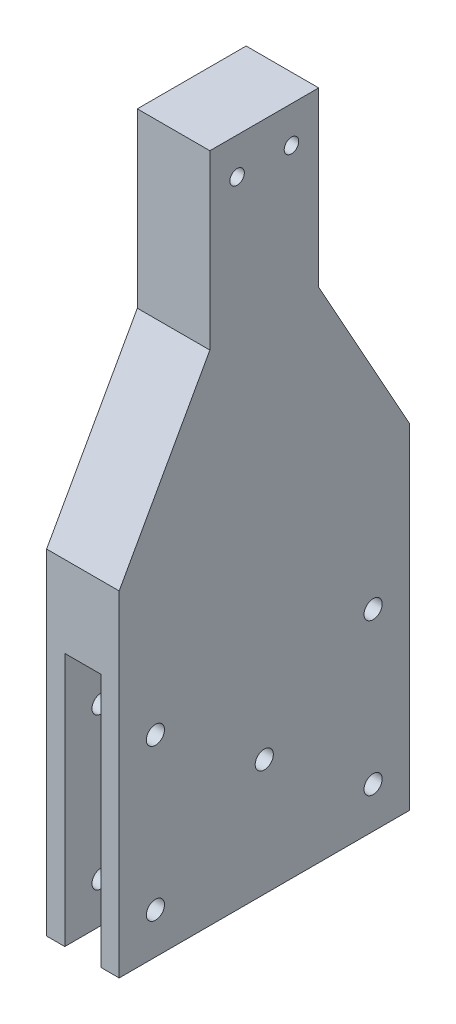
ISO-10303-21;
HEADER;
FILE_DESCRIPTION(('STEP AP214'),'2;1');
FILE_NAME('part.step','',(''),(''),'','','');
FILE_SCHEMA(('AUTOMOTIVE_DESIGN { 1 0 10303 214 1 1 1 1 }'));
ENDSEC;
DATA;
#1=APPLICATION_CONTEXT('core data for automotive mechanical design processes');
#2=APPLICATION_PROTOCOL_DEFINITION('international standard','automotive_design',2000,#1);
#3=PRODUCT_CONTEXT('',#1,'mechanical');
#4=PRODUCT('Part','Part','',(#3));
#5=PRODUCT_RELATED_PRODUCT_CATEGORY('part','',(#4));
#6=PRODUCT_DEFINITION_FORMATION('','',#4);
#7=PRODUCT_DEFINITION_CONTEXT('part definition',#1,'design');
#8=PRODUCT_DEFINITION('design','',#6,#7);
#9=PRODUCT_DEFINITION_SHAPE('','',#8);
#10=(LENGTH_UNIT() NAMED_UNIT(*) SI_UNIT(.MILLI.,.METRE.));
#11=(NAMED_UNIT(*) PLANE_ANGLE_UNIT() SI_UNIT($,.RADIAN.));
#12=(NAMED_UNIT(*) SI_UNIT($,.STERADIAN.) SOLID_ANGLE_UNIT());
#13=UNCERTAINTY_MEASURE_WITH_UNIT(LENGTH_MEASURE(1.E-05),#10,'distance_accuracy_value','');
#14=(GEOMETRIC_REPRESENTATION_CONTEXT(3) GLOBAL_UNCERTAINTY_ASSIGNED_CONTEXT((#13)) GLOBAL_UNIT_ASSIGNED_CONTEXT((#10,
#11,#12)) REPRESENTATION_CONTEXT('',''));
#15=CARTESIAN_POINT('',(0.,0.,0.));
#16=DIRECTION('',(0.,0.,1.));
#17=DIRECTION('',(1.,0.,0.));
#18=AXIS2_PLACEMENT_3D('',#15,#16,#17);
#19=CARTESIAN_POINT('',(0.,0.,80.));
#20=DIRECTION('',(1.,0.,0.));
#21=DIRECTION('',(0.,0.,-1.));
#22=AXIS2_PLACEMENT_3D('',#19,#20,#21);
#23=PLANE('',#22);
#24=CARTESIAN_POINT('',(0.,175.,32.5));
#25=DIRECTION('',(1.,0.,0.));
#26=DIRECTION('',(0.,0.,-1.));
#27=AXIS2_PLACEMENT_3D('',#24,#25,#26);
#28=CIRCLE('',#27,2.);
#29=CARTESIAN_POINT('',(0.,175.,30.5));
#30=VERTEX_POINT('',#29);
#31=EDGE_CURVE('E298',#30,#30,#28,.F.);
#32=ORIENTED_EDGE('',*,*,#31,.F.);
#33=EDGE_LOOP('',(#32));
#34=FACE_BOUND('',#33,.T.);
#35=CARTESIAN_POINT('',(0.,175.,47.5));
#36=DIRECTION('',(1.,0.,0.));
#37=DIRECTION('',(0.,0.,-1.));
#38=AXIS2_PLACEMENT_3D('',#35,#36,#37);
#39=CIRCLE('',#38,2.);
#40=CARTESIAN_POINT('',(0.,175.,45.5));
#41=VERTEX_POINT('',#40);
#42=EDGE_CURVE('E302',#41,#41,#39,.F.);
#43=ORIENTED_EDGE('',*,*,#42,.F.);
#44=EDGE_LOOP('',(#43));
#45=FACE_BOUND('',#44,.T.);
#46=CARTESIAN_POINT('',(0.,53.0571843789609,70.));
#47=DIRECTION('',(1.,0.,0.));
#48=DIRECTION('',(0.,0.,-1.));
#49=AXIS2_PLACEMENT_3D('',#46,#47,#48);
#50=CIRCLE('',#49,2.5);
#51=CARTESIAN_POINT('',(0.,53.0571843789609,67.5));
#52=VERTEX_POINT('',#51);
#53=EDGE_CURVE('E157',#52,#52,#50,.F.);
#54=ORIENTED_EDGE('',*,*,#53,.F.);
#55=EDGE_LOOP('',(#54));
#56=FACE_BOUND('',#55,.T.);
#57=CARTESIAN_POINT('',(0.,53.0571843789609,10.));
#58=DIRECTION('',(1.,0.,0.));
#59=DIRECTION('',(0.,0.,-1.));
#60=AXIS2_PLACEMENT_3D('',#57,#58,#59);
#61=CIRCLE('',#60,2.5);
#62=CARTESIAN_POINT('',(0.,53.0571843789609,7.5));
#63=VERTEX_POINT('',#62);
#64=EDGE_CURVE('E158',#63,#63,#61,.F.);
#65=ORIENTED_EDGE('',*,*,#64,.F.);
#66=EDGE_LOOP('',(#65));
#67=FACE_BOUND('',#66,.T.);
#68=CARTESIAN_POINT('',(0.,11.2845520257299,10.));
#69=DIRECTION('',(1.,0.,0.));
#70=DIRECTION('',(0.,0.,-1.));
#71=AXIS2_PLACEMENT_3D('',#68,#69,#70);
#72=CIRCLE('',#71,2.5);
#73=CARTESIAN_POINT('',(0.,11.2845520257299,7.5));
#74=VERTEX_POINT('',#73);
#75=EDGE_CURVE('E165',#74,#74,#72,.F.);
#76=ORIENTED_EDGE('',*,*,#75,.F.);
#77=EDGE_LOOP('',(#76));
#78=FACE_BOUND('',#77,.T.);
#79=CARTESIAN_POINT('',(0.,32.1708682023454,40.));
#80=DIRECTION('',(1.,0.,0.));
#81=DIRECTION('',(0.,0.,-1.));
#82=AXIS2_PLACEMENT_3D('',#79,#80,#81);
#83=CIRCLE('',#82,2.5);
#84=CARTESIAN_POINT('',(0.,32.1708682023454,37.5));
#85=VERTEX_POINT('',#84);
#86=EDGE_CURVE('E171',#85,#85,#83,.F.);
#87=ORIENTED_EDGE('',*,*,#86,.F.);
#88=EDGE_LOOP('',(#87));
#89=FACE_BOUND('',#88,.T.);
#90=CARTESIAN_POINT('',(0.,11.2845520257299,70.));
#91=DIRECTION('',(1.,0.,0.));
#92=DIRECTION('',(0.,0.,-1.));
#93=AXIS2_PLACEMENT_3D('',#90,#91,#92);
#94=CIRCLE('',#93,2.5);
#95=CARTESIAN_POINT('',(0.,11.2845520257299,67.5));
#96=VERTEX_POINT('',#95);
#97=EDGE_CURVE('E197',#96,#96,#94,.F.);
#98=ORIENTED_EDGE('',*,*,#97,.F.);
#99=EDGE_LOOP('',(#98));
#100=FACE_BOUND('',#99,.T.);
#101=DIRECTION('',(0.,1.,0.));
#102=VECTOR('',#101,1.);
#103=CARTESIAN_POINT('',(0.,0.,55.));
#104=LINE('',#103,#102);
#105=CARTESIAN_POINT('',(0.,137.406088826711,55.));
#106=VERTEX_POINT('',#105);
#107=CARTESIAN_POINT('',(0.,185.,55.));
#108=VERTEX_POINT('',#107);
#109=EDGE_CURVE('E148',#106,#108,#104,.T.);
#110=ORIENTED_EDGE('',*,*,#109,.T.);
#111=DIRECTION('',(0.,0.,-1.));
#112=VECTOR('',#111,1.);
#113=CARTESIAN_POINT('',(0.,185.,80.));
#114=LINE('',#113,#112);
#115=CARTESIAN_POINT('',(0.,185.,25.));
#116=VERTEX_POINT('',#115);
#117=EDGE_CURVE('E120',#108,#116,#114,.T.);
#118=ORIENTED_EDGE('',*,*,#117,.T.);
#119=DIRECTION('',(0.,1.,0.));
#120=VECTOR('',#119,1.);
#121=CARTESIAN_POINT('',(0.,0.,25.));
#122=LINE('',#121,#120);
#123=CARTESIAN_POINT('',(0.,137.406088826711,25.));
#124=VERTEX_POINT('',#123);
#125=EDGE_CURVE('E145',#124,#116,#122,.T.);
#126=ORIENTED_EDGE('',*,*,#125,.F.);
#127=DIRECTION('',(0.,-0.874157276121537,-0.485642931178633));
#128=VECTOR('',#127,1.);
#129=CARTESIAN_POINT('',(0.,21.7938888742245,-39.2289999736039));
#130=LINE('',#129,#128);
#131=CARTESIAN_POINT('',(0.,92.4060888267112,0.));
#132=VERTEX_POINT('',#131);
#133=EDGE_CURVE('E140',#124,#132,#130,.T.);
#134=ORIENTED_EDGE('',*,*,#133,.T.);
#135=DIRECTION('',(0.,-1.,0.));
#136=VECTOR('',#135,1.);
#137=CARTESIAN_POINT('',(0.,0.,0.));
#138=LINE('',#137,#136);
#139=CARTESIAN_POINT('',(0.,0.,0.));
#140=VERTEX_POINT('',#139);
#141=EDGE_CURVE('E227',#132,#140,#138,.T.);
#142=ORIENTED_EDGE('',*,*,#141,.T.);
#143=DIRECTION('',(0.,0.,-1.));
#144=VECTOR('',#143,1.);
#145=CARTESIAN_POINT('',(0.,0.,80.));
#146=LINE('',#145,#144);
#147=CARTESIAN_POINT('',(0.,0.,80.));
#148=VERTEX_POINT('',#147);
#149=EDGE_CURVE('E39',#148,#140,#146,.T.);
#150=ORIENTED_EDGE('',*,*,#149,.F.);
#151=DIRECTION('',(0.,-1.,0.));
#152=VECTOR('',#151,1.);
#153=CARTESIAN_POINT('',(0.,0.,80.));
#154=LINE('',#153,#152);
#155=CARTESIAN_POINT('',(0.,92.4060888267109,80.));
#156=VERTEX_POINT('',#155);
#157=EDGE_CURVE('E228',#156,#148,#154,.T.);
#158=ORIENTED_EDGE('',*,*,#157,.F.);
#159=DIRECTION('',(0.,-0.874157276121537,0.485642931178633));
#160=VECTOR('',#159,1.);
#161=CARTESIAN_POINT('',(0.,55.7561530251678,100.361075445302));
#162=LINE('',#161,#160);
#163=EDGE_CURVE('E152',#106,#156,#162,.T.);
#164=ORIENTED_EDGE('',*,*,#163,.F.);
#165=EDGE_LOOP('',(#110,#118,#126,#134,#142,#150,#158,#164));
#166=FACE_BOUND('',#165,.T.);
#167=ADVANCED_FACE('F32',(#34,#45,#56,#67,#78,#89,#100,#166),#23,.F.);
#168=CARTESIAN_POINT('',(20.,0.,80.));
#169=DIRECTION('',(-1.,0.,0.));
#170=DIRECTION('',(0.,0.,1.));
#171=AXIS2_PLACEMENT_3D('',#168,#169,#170);
#172=PLANE('',#171);
#173=CARTESIAN_POINT('',(20.,175.,32.5));
#174=DIRECTION('',(1.,0.,0.));
#175=DIRECTION('',(0.,0.,-1.));
#176=AXIS2_PLACEMENT_3D('',#173,#174,#175);
#177=CIRCLE('',#176,2.);
#178=CARTESIAN_POINT('',(20.,175.,30.5));
#179=VERTEX_POINT('',#178);
#180=EDGE_CURVE('E331',#179,#179,#177,.T.);
#181=ORIENTED_EDGE('',*,*,#180,.F.);
#182=EDGE_LOOP('',(#181));
#183=FACE_BOUND('',#182,.T.);
#184=CARTESIAN_POINT('',(20.,175.,47.5));
#185=DIRECTION('',(1.,0.,0.));
#186=DIRECTION('',(0.,0.,1.));
#187=AXIS2_PLACEMENT_3D('',#184,#185,#186);
#188=CIRCLE('',#187,2.);
#189=CARTESIAN_POINT('',(20.,175.,49.5));
#190=VERTEX_POINT('',#189);
#191=EDGE_CURVE('E124',#190,#190,#188,.T.);
#192=ORIENTED_EDGE('',*,*,#191,.F.);
#193=EDGE_LOOP('',(#192));
#194=FACE_BOUND('',#193,.T.);
#195=CARTESIAN_POINT('',(20.0000000000001,53.0571843789609,70.));
#196=DIRECTION('',(1.,0.,0.));
#197=DIRECTION('',(0.,1.,0.));
#198=AXIS2_PLACEMENT_3D('',#195,#196,#197);
#199=CIRCLE('',#198,2.5);
#200=CARTESIAN_POINT('',(20.0000000000001,55.5571843789609,70.));
#201=VERTEX_POINT('',#200);
#202=EDGE_CURVE('E154',#201,#201,#199,.T.);
#203=ORIENTED_EDGE('',*,*,#202,.F.);
#204=EDGE_LOOP('',(#203));
#205=FACE_BOUND('',#204,.T.);
#206=CARTESIAN_POINT('',(20.0000000000001,53.0571843789609,10.));
#207=DIRECTION('',(1.,0.,0.));
#208=DIRECTION('',(0.,1.,0.));
#209=AXIS2_PLACEMENT_3D('',#206,#207,#208);
#210=CIRCLE('',#209,2.5);
#211=CARTESIAN_POINT('',(20.0000000000001,55.5571843789609,10.));
#212=VERTEX_POINT('',#211);
#213=EDGE_CURVE('E162',#212,#212,#210,.T.);
#214=ORIENTED_EDGE('',*,*,#213,.F.);
#215=EDGE_LOOP('',(#214));
#216=FACE_BOUND('',#215,.T.);
#217=CARTESIAN_POINT('',(20.0000000000001,11.2845520257299,10.));
#218=DIRECTION('',(1.,0.,0.));
#219=DIRECTION('',(0.,1.,0.));
#220=AXIS2_PLACEMENT_3D('',#217,#218,#219);
#221=CIRCLE('',#220,2.5);
#222=CARTESIAN_POINT('',(20.0000000000001,13.7845520257299,10.));
#223=VERTEX_POINT('',#222);
#224=EDGE_CURVE('E168',#223,#223,#221,.T.);
#225=ORIENTED_EDGE('',*,*,#224,.F.);
#226=EDGE_LOOP('',(#225));
#227=FACE_BOUND('',#226,.T.);
#228=CARTESIAN_POINT('',(20.0000000000001,32.1708682023454,40.));
#229=DIRECTION('',(1.,0.,0.));
#230=DIRECTION('',(0.,1.,0.));
#231=AXIS2_PLACEMENT_3D('',#228,#229,#230);
#232=CIRCLE('',#231,2.5);
#233=CARTESIAN_POINT('',(20.0000000000001,34.6708682023454,40.));
#234=VERTEX_POINT('',#233);
#235=EDGE_CURVE('E174',#234,#234,#232,.T.);
#236=ORIENTED_EDGE('',*,*,#235,.F.);
#237=EDGE_LOOP('',(#236));
#238=FACE_BOUND('',#237,.T.);
#239=CARTESIAN_POINT('',(20.0000000000001,11.2845520257299,70.));
#240=DIRECTION('',(1.,0.,0.));
#241=DIRECTION('',(0.,1.,0.));
#242=AXIS2_PLACEMENT_3D('',#239,#240,#241);
#243=CIRCLE('',#242,2.5);
#244=CARTESIAN_POINT('',(20.0000000000001,13.7845520257299,70.));
#245=VERTEX_POINT('',#244);
#246=EDGE_CURVE('E194',#245,#245,#243,.T.);
#247=ORIENTED_EDGE('',*,*,#246,.F.);
#248=EDGE_LOOP('',(#247));
#249=FACE_BOUND('',#248,.T.);
#250=DIRECTION('',(0.,-1.,0.));
#251=VECTOR('',#250,1.);
#252=CARTESIAN_POINT('',(20.,0.,25.));
#253=LINE('',#252,#251);
#254=CARTESIAN_POINT('',(20.,185.,25.));
#255=VERTEX_POINT('',#254);
#256=CARTESIAN_POINT('',(20.,137.406088826711,25.));
#257=VERTEX_POINT('',#256);
#258=EDGE_CURVE('E133',#255,#257,#253,.T.);
#259=ORIENTED_EDGE('',*,*,#258,.F.);
#260=DIRECTION('',(0.,0.,-1.));
#261=VECTOR('',#260,1.);
#262=CARTESIAN_POINT('',(20.,185.,0.));
#263=LINE('',#262,#261);
#264=CARTESIAN_POINT('',(20.,185.,55.));
#265=VERTEX_POINT('',#264);
#266=EDGE_CURVE('E46',#265,#255,#263,.T.);
#267=ORIENTED_EDGE('',*,*,#266,.F.);
#268=DIRECTION('',(0.,-1.,0.));
#269=VECTOR('',#268,1.);
#270=CARTESIAN_POINT('',(20.,0.,55.));
#271=LINE('',#270,#269);
#272=CARTESIAN_POINT('',(20.,137.406088826711,55.));
#273=VERTEX_POINT('',#272);
#274=EDGE_CURVE('E130',#265,#273,#271,.T.);
#275=ORIENTED_EDGE('',*,*,#274,.T.);
#276=DIRECTION('',(0.,0.874157276121538,-0.485642931178633));
#277=VECTOR('',#276,1.);
#278=CARTESIAN_POINT('',(20.,55.7561530251678,100.361075445302));
#279=LINE('',#278,#277);
#280=CARTESIAN_POINT('',(20.,92.4060888267109,80.));
#281=VERTEX_POINT('',#280);
#282=EDGE_CURVE('E139',#281,#273,#279,.T.);
#283=ORIENTED_EDGE('',*,*,#282,.F.);
#284=DIRECTION('',(0.,1.,0.));
#285=VECTOR('',#284,1.);
#286=CARTESIAN_POINT('',(20.,0.,80.));
#287=LINE('',#286,#285);
#288=CARTESIAN_POINT('',(20.,0.,80.));
#289=VERTEX_POINT('',#288);
#290=EDGE_CURVE('E235',#289,#281,#287,.T.);
#291=ORIENTED_EDGE('',*,*,#290,.F.);
#292=DIRECTION('',(0.,0.,-1.));
#293=VECTOR('',#292,1.);
#294=CARTESIAN_POINT('',(20.,0.,80.));
#295=LINE('',#294,#293);
#296=CARTESIAN_POINT('',(20.,0.,0.));
#297=VERTEX_POINT('',#296);
#298=EDGE_CURVE('E238',#289,#297,#295,.T.);
#299=ORIENTED_EDGE('',*,*,#298,.T.);
#300=DIRECTION('',(0.,1.,0.));
#301=VECTOR('',#300,1.);
#302=CARTESIAN_POINT('',(20.,0.,0.));
#303=LINE('',#302,#301);
#304=CARTESIAN_POINT('',(20.,92.4060888267112,0.));
#305=VERTEX_POINT('',#304);
#306=EDGE_CURVE('E231',#297,#305,#303,.T.);
#307=ORIENTED_EDGE('',*,*,#306,.T.);
#308=DIRECTION('',(0.,0.874157276121537,0.485642931178634));
#309=VECTOR('',#308,1.);
#310=CARTESIAN_POINT('',(20.,21.7938888742245,-39.2289999736039));
#311=LINE('',#310,#309);
#312=EDGE_CURVE('E327',#305,#257,#311,.T.);
#313=ORIENTED_EDGE('',*,*,#312,.T.);
#314=EDGE_LOOP('',(#259,#267,#275,#283,#291,#299,#307,#313));
#315=FACE_BOUND('',#314,.T.);
#316=ADVANCED_FACE('F128',(#183,#194,#205,#216,#227,#238,#249,#315),#172,.F.);
#317=CARTESIAN_POINT('',(0.,0.,0.));
#318=DIRECTION('',(0.,0.,-1.));
#319=DIRECTION('',(-1.,0.,0.));
#320=AXIS2_PLACEMENT_3D('',#317,#318,#319);
#321=PLANE('',#320);
#322=ORIENTED_EDGE('',*,*,#141,.F.);
#323=DIRECTION('',(1.,0.,0.));
#324=VECTOR('',#323,1.);
#325=CARTESIAN_POINT('',(-268.759188302499,92.4060888267112,0.));
#326=LINE('',#325,#324);
#327=EDGE_CURVE('E320',#132,#305,#326,.T.);
#328=ORIENTED_EDGE('',*,*,#327,.T.);
#329=ORIENTED_EDGE('',*,*,#306,.F.);
#330=DIRECTION('',(1.,0.,0.));
#331=VECTOR('',#330,1.);
#332=CARTESIAN_POINT('',(0.,0.,0.));
#333=LINE('',#332,#331);
#334=CARTESIAN_POINT('',(15.,0.,0.));
#335=VERTEX_POINT('',#334);
#336=EDGE_CURVE('E240',#335,#297,#333,.T.);
#337=ORIENTED_EDGE('',*,*,#336,.F.);
#338=DIRECTION('',(0.,1.,0.));
#339=VECTOR('',#338,1.);
#340=CARTESIAN_POINT('',(15.,70.,0.));
#341=LINE('',#340,#339);
#342=CARTESIAN_POINT('',(15.,70.,0.));
#343=VERTEX_POINT('',#342);
#344=EDGE_CURVE('E220',#335,#343,#341,.T.);
#345=ORIENTED_EDGE('',*,*,#344,.T.);
#346=DIRECTION('',(-1.,0.,0.));
#347=VECTOR('',#346,1.);
#348=CARTESIAN_POINT('',(4.99999999999998,70.,0.));
#349=LINE('',#348,#347);
#350=CARTESIAN_POINT('',(4.99999999999998,70.,0.));
#351=VERTEX_POINT('',#350);
#352=EDGE_CURVE('E216',#343,#351,#349,.T.);
#353=ORIENTED_EDGE('',*,*,#352,.T.);
#354=DIRECTION('',(0.,-1.,0.));
#355=VECTOR('',#354,1.);
#356=CARTESIAN_POINT('',(4.99999999999998,70.,0.));
#357=LINE('',#356,#355);
#358=CARTESIAN_POINT('',(5.,0.,0.));
#359=VERTEX_POINT('',#358);
#360=EDGE_CURVE('E213',#351,#359,#357,.T.);
#361=ORIENTED_EDGE('',*,*,#360,.T.);
#362=EDGE_CURVE('E241',#140,#359,#333,.T.);
#363=ORIENTED_EDGE('',*,*,#362,.F.);
#364=EDGE_LOOP('',(#322,#328,#329,#337,#345,#353,#361,#363));
#365=FACE_BOUND('',#364,.T.);
#366=ADVANCED_FACE('F292',(#365),#321,.T.);
#367=CARTESIAN_POINT('',(0.,0.,80.));
#368=DIRECTION('',(0.,1.,0.));
#369=DIRECTION('',(0.,0.,1.));
#370=AXIS2_PLACEMENT_3D('',#367,#368,#369);
#371=PLANE('',#370);
#372=DIRECTION('',(1.,0.,0.));
#373=VECTOR('',#372,1.);
#374=CARTESIAN_POINT('',(0.,0.,80.));
#375=LINE('',#374,#373);
#376=CARTESIAN_POINT('',(15.,0.,80.));
#377=VERTEX_POINT('',#376);
#378=EDGE_CURVE('E230',#377,#289,#375,.T.);
#379=ORIENTED_EDGE('',*,*,#378,.F.);
#380=DIRECTION('',(0.,0.,1.));
#381=VECTOR('',#380,1.);
#382=CARTESIAN_POINT('',(15.,0.,-70.7106781186548));
#383=LINE('',#382,#381);
#384=EDGE_CURVE('E208',#335,#377,#383,.T.);
#385=ORIENTED_EDGE('',*,*,#384,.F.);
#386=ORIENTED_EDGE('',*,*,#336,.T.);
#387=ORIENTED_EDGE('',*,*,#298,.F.);
#388=EDGE_LOOP('',(#379,#385,#386,#387));
#389=FACE_BOUND('',#388,.T.);
#390=ADVANCED_FACE('F377',(#389),#371,.F.);
#391=ORIENTED_EDGE('',*,*,#362,.T.);
#392=DIRECTION('',(0.,0.,1.));
#393=VECTOR('',#392,1.);
#394=CARTESIAN_POINT('',(5.00000000000001,0.,-70.7106781186548));
#395=LINE('',#394,#393);
#396=CARTESIAN_POINT('',(5.00000000000001,0.,80.));
#397=VERTEX_POINT('',#396);
#398=EDGE_CURVE('E53',#359,#397,#395,.T.);
#399=ORIENTED_EDGE('',*,*,#398,.T.);
#400=EDGE_CURVE('E232',#148,#397,#375,.T.);
#401=ORIENTED_EDGE('',*,*,#400,.F.);
#402=ORIENTED_EDGE('',*,*,#149,.T.);
#403=EDGE_LOOP('',(#391,#399,#401,#402));
#404=FACE_BOUND('',#403,.T.);
#405=ADVANCED_FACE('F385',(#404),#371,.F.);
#406=CARTESIAN_POINT('',(0.,0.,80.));
#407=DIRECTION('',(0.,0.,-1.));
#408=DIRECTION('',(-1.,0.,0.));
#409=AXIS2_PLACEMENT_3D('',#406,#407,#408);
#410=PLANE('',#409);
#411=ORIENTED_EDGE('',*,*,#290,.T.);
#412=DIRECTION('',(1.,0.,0.));
#413=VECTOR('',#412,1.);
#414=CARTESIAN_POINT('',(-268.759188302499,92.4060888267109,80.));
#415=LINE('',#414,#413);
#416=EDGE_CURVE('E142',#156,#281,#415,.T.);
#417=ORIENTED_EDGE('',*,*,#416,.F.);
#418=ORIENTED_EDGE('',*,*,#157,.T.);
#419=ORIENTED_EDGE('',*,*,#400,.T.);
#420=DIRECTION('',(0.,-1.,0.));
#421=VECTOR('',#420,1.);
#422=CARTESIAN_POINT('',(4.99999999999998,70.,80.));
#423=LINE('',#422,#421);
#424=CARTESIAN_POINT('',(4.99999999999998,70.,80.));
#425=VERTEX_POINT('',#424);
#426=EDGE_CURVE('E204',#425,#397,#423,.T.);
#427=ORIENTED_EDGE('',*,*,#426,.F.);
#428=DIRECTION('',(-1.,0.,0.));
#429=VECTOR('',#428,1.);
#430=CARTESIAN_POINT('',(4.99999999999998,70.,80.));
#431=LINE('',#430,#429);
#432=CARTESIAN_POINT('',(15.,70.,80.));
#433=VERTEX_POINT('',#432);
#434=EDGE_CURVE('E205',#433,#425,#431,.T.);
#435=ORIENTED_EDGE('',*,*,#434,.F.);
#436=DIRECTION('',(0.,1.,0.));
#437=VECTOR('',#436,1.);
#438=CARTESIAN_POINT('',(15.,70.,80.));
#439=LINE('',#438,#437);
#440=EDGE_CURVE('E209',#377,#433,#439,.T.);
#441=ORIENTED_EDGE('',*,*,#440,.F.);
#442=ORIENTED_EDGE('',*,*,#378,.T.);
#443=EDGE_LOOP('',(#411,#417,#418,#419,#427,#435,#441,#442));
#444=FACE_BOUND('',#443,.T.);
#445=ADVANCED_FACE('F364',(#444),#410,.F.);
#446=CARTESIAN_POINT('',(15.,70.,-70.7106781186548));
#447=DIRECTION('',(1.,0.,0.));
#448=DIRECTION('',(0.,1.,0.));
#449=AXIS2_PLACEMENT_3D('',#446,#447,#448);
#450=PLANE('',#449);
#451=CARTESIAN_POINT('',(15.,53.0571843789609,70.));
#452=DIRECTION('',(1.,0.,0.));
#453=DIRECTION('',(0.,1.,0.));
#454=AXIS2_PLACEMENT_3D('',#451,#452,#453);
#455=CIRCLE('',#454,2.5);
#456=CARTESIAN_POINT('',(15.,55.5571843789609,70.));
#457=VERTEX_POINT('',#456);
#458=EDGE_CURVE('E191',#457,#457,#455,.T.);
#459=ORIENTED_EDGE('',*,*,#458,.T.);
#460=EDGE_LOOP('',(#459));
#461=FACE_BOUND('',#460,.T.);
#462=CARTESIAN_POINT('',(15.,53.0571843789609,10.));
#463=DIRECTION('',(1.,0.,0.));
#464=DIRECTION('',(0.,1.,0.));
#465=AXIS2_PLACEMENT_3D('',#462,#463,#464);
#466=CIRCLE('',#465,2.5);
#467=CARTESIAN_POINT('',(15.,55.5571843789609,10.));
#468=VERTEX_POINT('',#467);
#469=EDGE_CURVE('E187',#468,#468,#466,.T.);
#470=ORIENTED_EDGE('',*,*,#469,.T.);
#471=EDGE_LOOP('',(#470));
#472=FACE_BOUND('',#471,.T.);
#473=CARTESIAN_POINT('',(15.,11.2845520257299,10.));
#474=DIRECTION('',(1.,0.,0.));
#475=DIRECTION('',(0.,1.,0.));
#476=AXIS2_PLACEMENT_3D('',#473,#474,#475);
#477=CIRCLE('',#476,2.5);
#478=CARTESIAN_POINT('',(15.,13.7845520257299,10.));
#479=VERTEX_POINT('',#478);
#480=EDGE_CURVE('E183',#479,#479,#477,.T.);
#481=ORIENTED_EDGE('',*,*,#480,.T.);
#482=EDGE_LOOP('',(#481));
#483=FACE_BOUND('',#482,.T.);
#484=CARTESIAN_POINT('',(15.,32.1708682023454,40.));
#485=DIRECTION('',(1.,0.,0.));
#486=DIRECTION('',(0.,1.,0.));
#487=AXIS2_PLACEMENT_3D('',#484,#485,#486);
#488=CIRCLE('',#487,2.5);
#489=CARTESIAN_POINT('',(15.,34.6708682023454,40.));
#490=VERTEX_POINT('',#489);
#491=EDGE_CURVE('E179',#490,#490,#488,.T.);
#492=ORIENTED_EDGE('',*,*,#491,.T.);
#493=EDGE_LOOP('',(#492));
#494=FACE_BOUND('',#493,.T.);
#495=CARTESIAN_POINT('',(15.,11.2845520257299,70.));
#496=DIRECTION('',(1.,0.,0.));
#497=DIRECTION('',(0.,1.,0.));
#498=AXIS2_PLACEMENT_3D('',#495,#496,#497);
#499=CIRCLE('',#498,2.5);
#500=CARTESIAN_POINT('',(15.,13.7845520257299,70.));
#501=VERTEX_POINT('',#500);
#502=EDGE_CURVE('E201',#501,#501,#499,.T.);
#503=ORIENTED_EDGE('',*,*,#502,.T.);
#504=EDGE_LOOP('',(#503));
#505=FACE_BOUND('',#504,.T.);
#506=ORIENTED_EDGE('',*,*,#384,.T.);
#507=ORIENTED_EDGE('',*,*,#440,.T.);
#508=DIRECTION('',(0.,0.,1.));
#509=VECTOR('',#508,1.);
#510=CARTESIAN_POINT('',(15.,70.,-70.7106781186548));
#511=LINE('',#510,#509);
#512=EDGE_CURVE('E219',#343,#433,#511,.T.);
#513=ORIENTED_EDGE('',*,*,#512,.F.);
#514=ORIENTED_EDGE('',*,*,#344,.F.);
#515=EDGE_LOOP('',(#506,#507,#513,#514));
#516=FACE_BOUND('',#515,.T.);
#517=ADVANCED_FACE('F360',(#461,#472,#483,#494,#505,#516),#450,.F.);
#518=CARTESIAN_POINT('',(4.99999999999998,70.,-70.7106781186548));
#519=DIRECTION('',(0.,1.,0.));
#520=DIRECTION('',(-1.,0.,0.));
#521=AXIS2_PLACEMENT_3D('',#518,#519,#520);
#522=PLANE('',#521);
#523=ORIENTED_EDGE('',*,*,#512,.T.);
#524=ORIENTED_EDGE('',*,*,#434,.T.);
#525=DIRECTION('',(0.,0.,1.));
#526=VECTOR('',#525,1.);
#527=CARTESIAN_POINT('',(4.99999999999998,70.,-70.7106781186548));
#528=LINE('',#527,#526);
#529=EDGE_CURVE('E215',#351,#425,#528,.T.);
#530=ORIENTED_EDGE('',*,*,#529,.F.);
#531=ORIENTED_EDGE('',*,*,#352,.F.);
#532=EDGE_LOOP('',(#523,#524,#530,#531));
#533=FACE_BOUND('',#532,.T.);
#534=ADVANCED_FACE('F363',(#533),#522,.F.);
#535=CARTESIAN_POINT('',(4.99999999999998,70.,-70.7106781186548));
#536=DIRECTION('',(-1.,0.,0.));
#537=DIRECTION('',(0.,-1.,0.));
#538=AXIS2_PLACEMENT_3D('',#535,#536,#537);
#539=PLANE('',#538);
#540=CARTESIAN_POINT('',(4.99999999999999,53.0571843789609,70.));
#541=DIRECTION('',(-1.,0.,0.));
#542=DIRECTION('',(0.,-1.,0.));
#543=AXIS2_PLACEMENT_3D('',#540,#541,#542);
#544=CIRCLE('',#543,2.5);
#545=CARTESIAN_POINT('',(4.99999999999999,50.5571843789609,70.));
#546=VERTEX_POINT('',#545);
#547=EDGE_CURVE('E190',#546,#546,#544,.T.);
#548=ORIENTED_EDGE('',*,*,#547,.T.);
#549=EDGE_LOOP('',(#548));
#550=FACE_BOUND('',#549,.T.);
#551=CARTESIAN_POINT('',(4.99999999999999,53.0571843789609,10.));
#552=DIRECTION('',(-1.,0.,0.));
#553=DIRECTION('',(0.,-1.,0.));
#554=AXIS2_PLACEMENT_3D('',#551,#552,#553);
#555=CIRCLE('',#554,2.5);
#556=CARTESIAN_POINT('',(4.99999999999999,50.5571843789609,10.));
#557=VERTEX_POINT('',#556);
#558=EDGE_CURVE('E186',#557,#557,#555,.T.);
#559=ORIENTED_EDGE('',*,*,#558,.T.);
#560=EDGE_LOOP('',(#559));
#561=FACE_BOUND('',#560,.T.);
#562=CARTESIAN_POINT('',(5.00000000000001,11.2845520257299,10.));
#563=DIRECTION('',(-1.,0.,0.));
#564=DIRECTION('',(0.,-1.,0.));
#565=AXIS2_PLACEMENT_3D('',#562,#563,#564);
#566=CIRCLE('',#565,2.5);
#567=CARTESIAN_POINT('',(5.00000000000001,8.78455202572987,10.));
#568=VERTEX_POINT('',#567);
#569=EDGE_CURVE('E182',#568,#568,#566,.T.);
#570=ORIENTED_EDGE('',*,*,#569,.T.);
#571=EDGE_LOOP('',(#570));
#572=FACE_BOUND('',#571,.T.);
#573=CARTESIAN_POINT('',(5.,32.1708682023454,40.));
#574=DIRECTION('',(-1.,0.,0.));
#575=DIRECTION('',(0.,-1.,0.));
#576=AXIS2_PLACEMENT_3D('',#573,#574,#575);
#577=CIRCLE('',#576,2.5);
#578=CARTESIAN_POINT('',(5.,29.6708682023454,40.));
#579=VERTEX_POINT('',#578);
#580=EDGE_CURVE('E161',#579,#579,#577,.T.);
#581=ORIENTED_EDGE('',*,*,#580,.T.);
#582=EDGE_LOOP('',(#581));
#583=FACE_BOUND('',#582,.T.);
#584=CARTESIAN_POINT('',(5.00000000000001,11.2845520257299,70.));
#585=DIRECTION('',(-1.,0.,0.));
#586=DIRECTION('',(0.,-1.,0.));
#587=AXIS2_PLACEMENT_3D('',#584,#585,#586);
#588=CIRCLE('',#587,2.5);
#589=CARTESIAN_POINT('',(5.00000000000001,8.78455202572987,70.));
#590=VERTEX_POINT('',#589);
#591=EDGE_CURVE('E200',#590,#590,#588,.T.);
#592=ORIENTED_EDGE('',*,*,#591,.T.);
#593=EDGE_LOOP('',(#592));
#594=FACE_BOUND('',#593,.T.);
#595=ORIENTED_EDGE('',*,*,#529,.T.);
#596=ORIENTED_EDGE('',*,*,#426,.T.);
#597=ORIENTED_EDGE('',*,*,#398,.F.);
#598=ORIENTED_EDGE('',*,*,#360,.F.);
#599=EDGE_LOOP('',(#595,#596,#597,#598));
#600=FACE_BOUND('',#599,.T.);
#601=ADVANCED_FACE('F260',(#550,#561,#572,#583,#594,#600),#539,.F.);
#602=CARTESIAN_POINT('',(-7.07106781186548,11.2845520257299,70.));
#603=DIRECTION('',(1.,0.,0.));
#604=DIRECTION('',(0.,1.,0.));
#605=AXIS2_PLACEMENT_3D('',#602,#603,#604);
#606=CYLINDRICAL_SURFACE('',#605,2.5);
#607=ORIENTED_EDGE('',*,*,#97,.T.);
#608=EDGE_LOOP('',(#607));
#609=FACE_BOUND('',#608,.T.);
#610=ORIENTED_EDGE('',*,*,#591,.F.);
#611=EDGE_LOOP('',(#610));
#612=FACE_BOUND('',#611,.T.);
#613=ADVANCED_FACE('F356',(#609,#612),#606,.F.);
#614=ORIENTED_EDGE('',*,*,#246,.T.);
#615=EDGE_LOOP('',(#614));
#616=FACE_BOUND('',#615,.T.);
#617=ORIENTED_EDGE('',*,*,#502,.F.);
#618=EDGE_LOOP('',(#617));
#619=FACE_BOUND('',#618,.T.);
#620=ADVANCED_FACE('F353',(#616,#619),#606,.F.);
#621=CARTESIAN_POINT('',(-7.07106781186548,32.1708682023454,40.));
#622=DIRECTION('',(1.,0.,0.));
#623=DIRECTION('',(0.,1.,0.));
#624=AXIS2_PLACEMENT_3D('',#621,#622,#623);
#625=CYLINDRICAL_SURFACE('',#624,2.5);
#626=ORIENTED_EDGE('',*,*,#86,.T.);
#627=EDGE_LOOP('',(#626));
#628=FACE_BOUND('',#627,.T.);
#629=ORIENTED_EDGE('',*,*,#580,.F.);
#630=EDGE_LOOP('',(#629));
#631=FACE_BOUND('',#630,.T.);
#632=ADVANCED_FACE('F277',(#628,#631),#625,.F.);
#633=CARTESIAN_POINT('',(-7.07106781186548,11.2845520257299,10.));
#634=DIRECTION('',(1.,0.,0.));
#635=DIRECTION('',(0.,1.,0.));
#636=AXIS2_PLACEMENT_3D('',#633,#634,#635);
#637=CYLINDRICAL_SURFACE('',#636,2.5);
#638=ORIENTED_EDGE('',*,*,#75,.T.);
#639=EDGE_LOOP('',(#638));
#640=FACE_BOUND('',#639,.T.);
#641=ORIENTED_EDGE('',*,*,#569,.F.);
#642=EDGE_LOOP('',(#641));
#643=FACE_BOUND('',#642,.T.);
#644=ADVANCED_FACE('F278',(#640,#643),#637,.F.);
#645=CARTESIAN_POINT('',(-7.07106781186549,53.0571843789609,10.));
#646=DIRECTION('',(1.,0.,0.));
#647=DIRECTION('',(0.,1.,0.));
#648=AXIS2_PLACEMENT_3D('',#645,#646,#647);
#649=CYLINDRICAL_SURFACE('',#648,2.5);
#650=ORIENTED_EDGE('',*,*,#64,.T.);
#651=EDGE_LOOP('',(#650));
#652=FACE_BOUND('',#651,.T.);
#653=ORIENTED_EDGE('',*,*,#558,.F.);
#654=EDGE_LOOP('',(#653));
#655=FACE_BOUND('',#654,.T.);
#656=ADVANCED_FACE('F266',(#652,#655),#649,.F.);
#657=CARTESIAN_POINT('',(-7.07106781186549,53.0571843789609,70.));
#658=DIRECTION('',(1.,0.,0.));
#659=DIRECTION('',(0.,1.,0.));
#660=AXIS2_PLACEMENT_3D('',#657,#658,#659);
#661=CYLINDRICAL_SURFACE('',#660,2.5);
#662=ORIENTED_EDGE('',*,*,#53,.T.);
#663=EDGE_LOOP('',(#662));
#664=FACE_BOUND('',#663,.T.);
#665=ORIENTED_EDGE('',*,*,#547,.F.);
#666=EDGE_LOOP('',(#665));
#667=FACE_BOUND('',#666,.T.);
#668=ADVANCED_FACE('F263',(#664,#667),#661,.F.);
#669=ORIENTED_EDGE('',*,*,#235,.T.);
#670=EDGE_LOOP('',(#669));
#671=FACE_BOUND('',#670,.T.);
#672=ORIENTED_EDGE('',*,*,#491,.F.);
#673=EDGE_LOOP('',(#672));
#674=FACE_BOUND('',#673,.T.);
#675=ADVANCED_FACE('F265',(#671,#674),#625,.F.);
#676=ORIENTED_EDGE('',*,*,#224,.T.);
#677=EDGE_LOOP('',(#676));
#678=FACE_BOUND('',#677,.T.);
#679=ORIENTED_EDGE('',*,*,#480,.F.);
#680=EDGE_LOOP('',(#679));
#681=FACE_BOUND('',#680,.T.);
#682=ADVANCED_FACE('F274',(#678,#681),#637,.F.);
#683=ORIENTED_EDGE('',*,*,#213,.T.);
#684=EDGE_LOOP('',(#683));
#685=FACE_BOUND('',#684,.T.);
#686=ORIENTED_EDGE('',*,*,#469,.F.);
#687=EDGE_LOOP('',(#686));
#688=FACE_BOUND('',#687,.T.);
#689=ADVANCED_FACE('F281',(#685,#688),#649,.F.);
#690=ORIENTED_EDGE('',*,*,#202,.T.);
#691=EDGE_LOOP('',(#690));
#692=FACE_BOUND('',#691,.T.);
#693=ORIENTED_EDGE('',*,*,#458,.F.);
#694=EDGE_LOOP('',(#693));
#695=FACE_BOUND('',#694,.T.);
#696=ADVANCED_FACE('F269',(#692,#695),#661,.F.);
#697=CARTESIAN_POINT('',(-268.759188302499,55.7561530251678,100.361075445302));
#698=DIRECTION('',(0.,-0.485642931178633,-0.874157276121537));
#699=DIRECTION('',(0.,0.874157276121537,-0.485642931178633));
#700=AXIS2_PLACEMENT_3D('',#697,#698,#699);
#701=PLANE('',#700);
#702=ORIENTED_EDGE('',*,*,#163,.T.);
#703=ORIENTED_EDGE('',*,*,#416,.T.);
#704=ORIENTED_EDGE('',*,*,#282,.T.);
#705=DIRECTION('',(1.,0.,0.));
#706=VECTOR('',#705,1.);
#707=CARTESIAN_POINT('',(-268.759188302499,137.406088826711,55.));
#708=LINE('',#707,#706);
#709=EDGE_CURVE('E137',#106,#273,#708,.T.);
#710=ORIENTED_EDGE('',*,*,#709,.F.);
#711=EDGE_LOOP('',(#702,#703,#704,#710));
#712=FACE_BOUND('',#711,.T.);
#713=ADVANCED_FACE('F284',(#712),#701,.F.);
#714=CARTESIAN_POINT('',(-268.759188302499,0.,55.));
#715=DIRECTION('',(0.,0.,1.));
#716=DIRECTION('',(0.,-1.,0.));
#717=AXIS2_PLACEMENT_3D('',#714,#715,#716);
#718=PLANE('',#717);
#719=DIRECTION('',(1.,0.,0.));
#720=VECTOR('',#719,1.);
#721=CARTESIAN_POINT('',(-268.759188302499,185.,55.));
#722=LINE('',#721,#720);
#723=EDGE_CURVE('E117',#108,#265,#722,.T.);
#724=ORIENTED_EDGE('',*,*,#723,.F.);
#725=ORIENTED_EDGE('',*,*,#109,.F.);
#726=ORIENTED_EDGE('',*,*,#709,.T.);
#727=ORIENTED_EDGE('',*,*,#274,.F.);
#728=EDGE_LOOP('',(#724,#725,#726,#727));
#729=FACE_BOUND('',#728,.T.);
#730=ADVANCED_FACE('F135',(#729),#718,.T.);
#731=CARTESIAN_POINT('',(-268.759188302499,21.7938888742245,-39.2289999736039));
#732=DIRECTION('',(0.,0.485642931178634,-0.874157276121537));
#733=DIRECTION('',(0.,0.874157276121537,0.485642931178633));
#734=AXIS2_PLACEMENT_3D('',#731,#732,#733);
#735=PLANE('',#734);
#736=DIRECTION('',(1.,0.,0.));
#737=VECTOR('',#736,1.);
#738=CARTESIAN_POINT('',(-268.759188302499,137.406088826711,25.));
#739=LINE('',#738,#737);
#740=EDGE_CURVE('E323',#124,#257,#739,.T.);
#741=ORIENTED_EDGE('',*,*,#740,.T.);
#742=ORIENTED_EDGE('',*,*,#312,.F.);
#743=ORIENTED_EDGE('',*,*,#327,.F.);
#744=ORIENTED_EDGE('',*,*,#133,.F.);
#745=EDGE_LOOP('',(#741,#742,#743,#744));
#746=FACE_BOUND('',#745,.T.);
#747=ADVANCED_FACE('F390',(#746),#735,.T.);
#748=CARTESIAN_POINT('',(-268.759188302499,0.,25.));
#749=DIRECTION('',(0.,0.,1.));
#750=DIRECTION('',(0.,-1.,0.));
#751=AXIS2_PLACEMENT_3D('',#748,#749,#750);
#752=PLANE('',#751);
#753=ORIENTED_EDGE('',*,*,#125,.T.);
#754=DIRECTION('',(1.,0.,0.));
#755=VECTOR('',#754,1.);
#756=CARTESIAN_POINT('',(-268.759188302499,185.,25.));
#757=LINE('',#756,#755);
#758=EDGE_CURVE('E11',#116,#255,#757,.T.);
#759=ORIENTED_EDGE('',*,*,#758,.T.);
#760=ORIENTED_EDGE('',*,*,#258,.T.);
#761=ORIENTED_EDGE('',*,*,#740,.F.);
#762=EDGE_LOOP('',(#753,#759,#760,#761));
#763=FACE_BOUND('',#762,.T.);
#764=ADVANCED_FACE('F393',(#763),#752,.F.);
#765=CARTESIAN_POINT('',(-5.65685424949239,175.,47.5));
#766=DIRECTION('',(1.,0.,0.));
#767=DIRECTION('',(0.,0.,-1.));
#768=AXIS2_PLACEMENT_3D('',#765,#766,#767);
#769=CYLINDRICAL_SURFACE('',#768,2.);
#770=ORIENTED_EDGE('',*,*,#42,.T.);
#771=EDGE_LOOP('',(#770));
#772=FACE_BOUND('',#771,.T.);
#773=ORIENTED_EDGE('',*,*,#191,.T.);
#774=EDGE_LOOP('',(#773));
#775=FACE_BOUND('',#774,.T.);
#776=ADVANCED_FACE('F395',(#772,#775),#769,.F.);
#777=CARTESIAN_POINT('',(-5.65685424949239,175.,32.5));
#778=DIRECTION('',(1.,0.,0.));
#779=DIRECTION('',(0.,0.,-1.));
#780=AXIS2_PLACEMENT_3D('',#777,#778,#779);
#781=CYLINDRICAL_SURFACE('',#780,2.);
#782=ORIENTED_EDGE('',*,*,#31,.T.);
#783=EDGE_LOOP('',(#782));
#784=FACE_BOUND('',#783,.T.);
#785=ORIENTED_EDGE('',*,*,#180,.T.);
#786=EDGE_LOOP('',(#785));
#787=FACE_BOUND('',#786,.T.);
#788=ADVANCED_FACE('F339',(#784,#787),#781,.F.);
#789=CARTESIAN_POINT('',(-443.,185.,0.));
#790=DIRECTION('',(0.,-1.,0.));
#791=DIRECTION('',(0.,0.,-1.));
#792=AXIS2_PLACEMENT_3D('',#789,#790,#791);
#793=PLANE('',#792);
#794=ORIENTED_EDGE('',*,*,#723,.T.);
#795=ORIENTED_EDGE('',*,*,#266,.T.);
#796=ORIENTED_EDGE('',*,*,#758,.F.);
#797=ORIENTED_EDGE('',*,*,#117,.F.);
#798=EDGE_LOOP('',(#794,#795,#796,#797));
#799=FACE_BOUND('',#798,.T.);
#800=ADVANCED_FACE('F118',(#799),#793,.F.);
#801=CLOSED_SHELL('',(#167,#316,#366,#390,#405,#445,#517,#534,#601,#613,#620,#632,#644,#656,
#668,#675,#682,#689,#696,#713,#730,#747,#764,#776,#788,#800));
#802=MANIFOLD_SOLID_BREP('B2',#801);
#803=ADVANCED_BREP_SHAPE_REPRESENTATION('',(#18,#802),#14);
#804=SHAPE_DEFINITION_REPRESENTATION(#9,#803);
ENDSEC;
END-ISO-10303-21;
